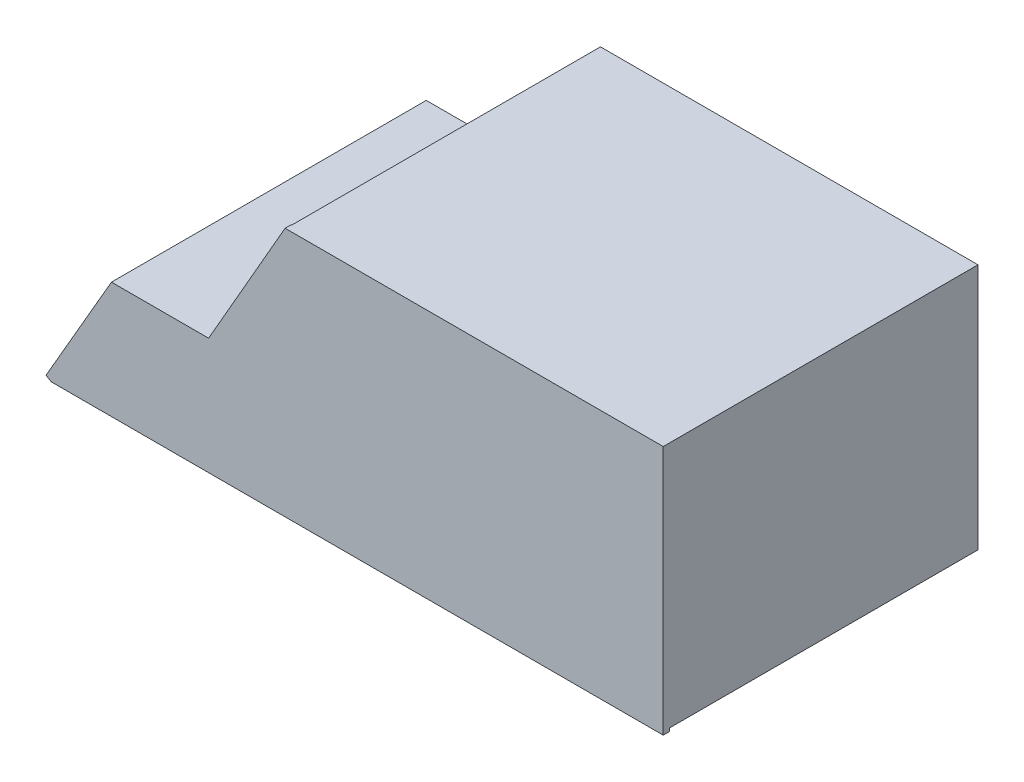
ISO-10303-21;
HEADER;
FILE_DESCRIPTION(('STEP AP214'),'2;1');
FILE_NAME('part.step','',(''),(''),'','','');
FILE_SCHEMA(('AUTOMOTIVE_DESIGN { 1 0 10303 214 1 1 1 1 }'));
ENDSEC;
DATA;
#1=APPLICATION_CONTEXT('core data for automotive mechanical design processes');
#2=APPLICATION_PROTOCOL_DEFINITION('international standard','automotive_design',2000,#1);
#3=PRODUCT_CONTEXT('',#1,'mechanical');
#4=PRODUCT('Part','Part','',(#3));
#5=PRODUCT_RELATED_PRODUCT_CATEGORY('part','',(#4));
#6=PRODUCT_DEFINITION_FORMATION('','',#4);
#7=PRODUCT_DEFINITION_CONTEXT('part definition',#1,'design');
#8=PRODUCT_DEFINITION('design','',#6,#7);
#9=PRODUCT_DEFINITION_SHAPE('','',#8);
#10=(LENGTH_UNIT() NAMED_UNIT(*) SI_UNIT(.MILLI.,.METRE.));
#11=(NAMED_UNIT(*) PLANE_ANGLE_UNIT() SI_UNIT($,.RADIAN.));
#12=(NAMED_UNIT(*) SI_UNIT($,.STERADIAN.) SOLID_ANGLE_UNIT());
#13=UNCERTAINTY_MEASURE_WITH_UNIT(LENGTH_MEASURE(1.E-05),#10,'distance_accuracy_value','');
#14=(GEOMETRIC_REPRESENTATION_CONTEXT(3) GLOBAL_UNCERTAINTY_ASSIGNED_CONTEXT((#13)) GLOBAL_UNIT_ASSIGNED_CONTEXT((#10,
#11,#12)) REPRESENTATION_CONTEXT('',''));
#15=CARTESIAN_POINT('',(0.,0.,0.));
#16=DIRECTION('',(0.,0.,1.));
#17=DIRECTION('',(1.,0.,0.));
#18=AXIS2_PLACEMENT_3D('',#15,#16,#17);
#19=CARTESIAN_POINT('',(148.41450507733,79.6367132867134,100.));
#20=DIRECTION('',(1.,0.,0.));
#21=DIRECTION('',(0.,0.,-1.));
#22=AXIS2_PLACEMENT_3D('',#19,#20,#21);
#23=PLANE('',#22);
#24=DIRECTION('',(0.,1.,0.));
#25=VECTOR('',#24,1.);
#26=CARTESIAN_POINT('',(148.41450507733,79.6367132867134,0.));
#27=LINE('',#26,#25);
#28=CARTESIAN_POINT('',(148.41450507733,77.6367132867134,0.));
#29=VERTEX_POINT('',#28);
#30=CARTESIAN_POINT('',(148.41450507733,-0.363286713286629,0.));
#31=VERTEX_POINT('',#30);
#32=EDGE_CURVE('E159',#29,#31,#27,.F.);
#33=ORIENTED_EDGE('',*,*,#32,.T.);
#34=DIRECTION('',(0.,0.,-1.));
#35=VECTOR('',#34,1.);
#36=CARTESIAN_POINT('',(148.41450507733,-0.363286713286629,100.));
#37=LINE('',#36,#35);
#38=CARTESIAN_POINT('',(148.41450507733,-0.363286713286629,100.));
#39=VERTEX_POINT('',#38);
#40=EDGE_CURVE('E11',#39,#31,#37,.T.);
#41=ORIENTED_EDGE('',*,*,#40,.F.);
#42=DIRECTION('',(0.,1.,0.));
#43=VECTOR('',#42,1.);
#44=CARTESIAN_POINT('',(148.41450507733,79.6367132867134,100.));
#45=LINE('',#44,#43);
#46=CARTESIAN_POINT('',(148.41450507733,77.6367132867134,100.));
#47=VERTEX_POINT('',#46);
#48=EDGE_CURVE('E188',#47,#39,#45,.F.);
#49=ORIENTED_EDGE('',*,*,#48,.F.);
#50=DIRECTION('',(0.,0.,-1.));
#51=VECTOR('',#50,1.);
#52=CARTESIAN_POINT('',(148.41450507733,77.6367132867134,100.));
#53=LINE('',#52,#51);
#54=EDGE_CURVE('E158',#47,#29,#53,.T.);
#55=ORIENTED_EDGE('',*,*,#54,.T.);
#56=EDGE_LOOP('',(#33,#41,#49,#55));
#57=FACE_BOUND('',#56,.T.);
#58=ADVANCED_FACE('F31',(#57),#23,.F.);
#59=CARTESIAN_POINT('',(150.41450507733,-0.363286713286632,100.));
#60=DIRECTION('',(0.,-1.,0.));
#61=DIRECTION('',(1.,0.,0.));
#62=AXIS2_PLACEMENT_3D('',#59,#60,#61);
#63=PLANE('',#62);
#64=DIRECTION('',(-1.,0.,0.));
#65=VECTOR('',#64,1.);
#66=CARTESIAN_POINT('',(150.41450507733,-0.363286713286632,0.));
#67=LINE('',#66,#65);
#68=CARTESIAN_POINT('',(150.41450507733,-0.363286713286632,0.));
#69=VERTEX_POINT('',#68);
#70=EDGE_CURVE('E161',#69,#31,#67,.T.);
#71=ORIENTED_EDGE('',*,*,#70,.F.);
#72=DIRECTION('',(0.,0.,-1.));
#73=VECTOR('',#72,1.);
#74=CARTESIAN_POINT('',(150.41450507733,-0.363286713286632,100.));
#75=LINE('',#74,#73);
#76=CARTESIAN_POINT('',(150.41450507733,-0.363286713286632,100.));
#77=VERTEX_POINT('',#76);
#78=EDGE_CURVE('E41',#77,#69,#75,.T.);
#79=ORIENTED_EDGE('',*,*,#78,.F.);
#80=DIRECTION('',(-1.,0.,0.));
#81=VECTOR('',#80,1.);
#82=CARTESIAN_POINT('',(150.41450507733,-0.363286713286632,100.));
#83=LINE('',#82,#81);
#84=EDGE_CURVE('E34',#77,#39,#83,.T.);
#85=ORIENTED_EDGE('',*,*,#84,.T.);
#86=ORIENTED_EDGE('',*,*,#40,.T.);
#87=EDGE_LOOP('',(#71,#79,#85,#86));
#88=FACE_BOUND('',#87,.T.);
#89=ADVANCED_FACE('F217',(#88),#63,.T.);
#90=CARTESIAN_POINT('',(150.41450507733,79.6367132867134,100.));
#91=DIRECTION('',(1.,0.,0.));
#92=DIRECTION('',(0.,0.,-1.));
#93=AXIS2_PLACEMENT_3D('',#90,#91,#92);
#94=PLANE('',#93);
#95=DIRECTION('',(0.,-1.,0.));
#96=VECTOR('',#95,1.);
#97=CARTESIAN_POINT('',(150.41450507733,79.6367132867134,0.));
#98=LINE('',#97,#96);
#99=CARTESIAN_POINT('',(150.41450507733,79.6367132867134,0.));
#100=VERTEX_POINT('',#99);
#101=EDGE_CURVE('E165',#100,#69,#98,.T.);
#102=ORIENTED_EDGE('',*,*,#101,.F.);
#103=DIRECTION('',(0.,0.,-1.));
#104=VECTOR('',#103,1.);
#105=CARTESIAN_POINT('',(150.41450507733,79.6367132867134,100.));
#106=LINE('',#105,#104);
#107=CARTESIAN_POINT('',(150.41450507733,79.6367132867134,102.));
#108=VERTEX_POINT('',#107);
#109=EDGE_CURVE('E200',#108,#100,#106,.T.);
#110=ORIENTED_EDGE('',*,*,#109,.F.);
#111=DIRECTION('',(0.,1.,0.));
#112=VECTOR('',#111,1.);
#113=CARTESIAN_POINT('',(150.41450507733,79.6367132867134,102.));
#114=LINE('',#113,#112);
#115=CARTESIAN_POINT('',(150.41450507733,-1.3632867132866,102.));
#116=VERTEX_POINT('',#115);
#117=EDGE_CURVE('E234',#116,#108,#114,.T.);
#118=ORIENTED_EDGE('',*,*,#117,.F.);
#119=DIRECTION('',(0.,0.,-1.));
#120=VECTOR('',#119,1.);
#121=CARTESIAN_POINT('',(150.41450507733,-1.3632867132866,102.));
#122=LINE('',#121,#120);
#123=CARTESIAN_POINT('',(150.41450507733,-1.3632867132866,100.));
#124=VERTEX_POINT('',#123);
#125=EDGE_CURVE('E279',#116,#124,#122,.T.);
#126=ORIENTED_EDGE('',*,*,#125,.T.);
#127=DIRECTION('',(0.,1.,0.));
#128=VECTOR('',#127,1.);
#129=CARTESIAN_POINT('',(150.41450507733,79.6367132867134,100.));
#130=LINE('',#129,#128);
#131=EDGE_CURVE('E215',#124,#77,#130,.T.);
#132=ORIENTED_EDGE('',*,*,#131,.T.);
#133=ORIENTED_EDGE('',*,*,#78,.T.);
#134=EDGE_LOOP('',(#102,#110,#118,#126,#132,#133));
#135=FACE_BOUND('',#134,.T.);
#136=ADVANCED_FACE('F212',(#135),#94,.T.);
#137=CARTESIAN_POINT('',(28.0835250406207,79.6367132867134,100.));
#138=DIRECTION('',(0.,1.,0.));
#139=DIRECTION('',(0.,0.,1.));
#140=AXIS2_PLACEMENT_3D('',#137,#138,#139);
#141=PLANE('',#140);
#142=DIRECTION('',(1.,0.,0.));
#143=VECTOR('',#142,1.);
#144=CARTESIAN_POINT('',(28.0835250406207,79.6367132867134,0.));
#145=LINE('',#144,#143);
#146=CARTESIAN_POINT('',(28.0835250406207,79.6367132867134,0.));
#147=VERTEX_POINT('',#146);
#148=EDGE_CURVE('E168',#147,#100,#145,.T.);
#149=ORIENTED_EDGE('',*,*,#148,.F.);
#150=DIRECTION('',(0.,0.,-1.));
#151=VECTOR('',#150,1.);
#152=CARTESIAN_POINT('',(28.0835250406207,79.6367132867134,100.));
#153=LINE('',#152,#151);
#154=CARTESIAN_POINT('',(28.0835250406207,79.6367132867134,100.));
#155=VERTEX_POINT('',#154);
#156=EDGE_CURVE('E199',#155,#147,#153,.T.);
#157=ORIENTED_EDGE('',*,*,#156,.F.);
#158=DIRECTION('',(-1.,0.,0.));
#159=VECTOR('',#158,1.);
#160=CARTESIAN_POINT('',(150.41450507733,79.6367132867134,100.));
#161=LINE('',#160,#159);
#162=CARTESIAN_POINT('',(27.8991416528759,79.6367132867134,100.));
#163=VERTEX_POINT('',#162);
#164=EDGE_CURVE('E256',#155,#163,#161,.T.);
#165=ORIENTED_EDGE('',*,*,#164,.T.);
#166=DIRECTION('',(0.,0.,-1.));
#167=VECTOR('',#166,1.);
#168=CARTESIAN_POINT('',(27.8991416528759,79.6367132867134,102.));
#169=LINE('',#168,#167);
#170=CARTESIAN_POINT('',(27.8991416528759,79.6367132867134,102.));
#171=VERTEX_POINT('',#170);
#172=EDGE_CURVE('E162',#171,#163,#169,.T.);
#173=ORIENTED_EDGE('',*,*,#172,.F.);
#174=DIRECTION('',(-1.,0.,0.));
#175=VECTOR('',#174,1.);
#176=CARTESIAN_POINT('',(150.41450507733,79.6367132867134,102.));
#177=LINE('',#176,#175);
#178=EDGE_CURVE('E230',#108,#171,#177,.T.);
#179=ORIENTED_EDGE('',*,*,#178,.F.);
#180=ORIENTED_EDGE('',*,*,#109,.T.);
#181=EDGE_LOOP('',(#149,#157,#165,#173,#179,#180));
#182=FACE_BOUND('',#181,.T.);
#183=ADVANCED_FACE('F224',(#182),#141,.T.);
#184=CARTESIAN_POINT('',(3.10870694104737,36.3790594284613,100.));
#185=DIRECTION('',(-0.86602540378444,0.499999999999998,0.));
#186=DIRECTION('',(-0.499999999999998,-0.86602540378444,0.));
#187=AXIS2_PLACEMENT_3D('',#184,#185,#186);
#188=PLANE('',#187);
#189=DIRECTION('',(0.499999999999998,0.86602540378444,0.));
#190=VECTOR('',#189,1.);
#191=CARTESIAN_POINT('',(3.10870694104737,36.3790594284613,0.));
#192=LINE('',#191,#190);
#193=CARTESIAN_POINT('',(3.10870694104737,36.3790594284613,0.));
#194=VERTEX_POINT('',#193);
#195=EDGE_CURVE('E171',#194,#147,#192,.T.);
#196=ORIENTED_EDGE('',*,*,#195,.F.);
#197=DIRECTION('',(0.,0.,-1.));
#198=VECTOR('',#197,1.);
#199=CARTESIAN_POINT('',(3.10870694104737,36.3790594284613,100.));
#200=LINE('',#199,#198);
#201=CARTESIAN_POINT('',(3.10870694104737,36.3790594284613,100.));
#202=VERTEX_POINT('',#201);
#203=EDGE_CURVE('E197',#202,#194,#200,.T.);
#204=ORIENTED_EDGE('',*,*,#203,.F.);
#205=DIRECTION('',(0.499999999999998,0.86602540378444,0.));
#206=VECTOR('',#205,1.);
#207=CARTESIAN_POINT('',(3.10870694104737,36.3790594284613,100.));
#208=LINE('',#207,#206);
#209=EDGE_CURVE('E147',#202,#155,#208,.T.);
#210=ORIENTED_EDGE('',*,*,#209,.T.);
#211=ORIENTED_EDGE('',*,*,#156,.T.);
#212=EDGE_LOOP('',(#196,#204,#210,#211));
#213=FACE_BOUND('',#212,.T.);
#214=ADVANCED_FACE('F321',(#213),#188,.T.);
#215=CARTESIAN_POINT('',(-28.3722914870734,36.3790594284613,100.));
#216=DIRECTION('',(0.,1.,0.));
#217=DIRECTION('',(0.,0.,1.));
#218=AXIS2_PLACEMENT_3D('',#215,#216,#217);
#219=PLANE('',#218);
#220=DIRECTION('',(1.,0.,0.));
#221=VECTOR('',#220,1.);
#222=CARTESIAN_POINT('',(-28.3722914870734,36.3790594284613,0.));
#223=LINE('',#222,#221);
#224=CARTESIAN_POINT('',(-28.3722914870734,36.3790594284613,0.));
#225=VERTEX_POINT('',#224);
#226=EDGE_CURVE('E174',#225,#194,#223,.T.);
#227=ORIENTED_EDGE('',*,*,#226,.F.);
#228=DIRECTION('',(0.,0.,-1.));
#229=VECTOR('',#228,1.);
#230=CARTESIAN_POINT('',(-28.3722914870734,36.3790594284613,100.));
#231=LINE('',#230,#229);
#232=CARTESIAN_POINT('',(-28.3722914870734,36.3790594284613,102.));
#233=VERTEX_POINT('',#232);
#234=EDGE_CURVE('E195',#233,#225,#231,.T.);
#235=ORIENTED_EDGE('',*,*,#234,.F.);
#236=DIRECTION('',(-1.,0.,0.));
#237=VECTOR('',#236,1.);
#238=CARTESIAN_POINT('',(-28.3722914870734,36.3790594284613,102.));
#239=LINE('',#238,#237);
#240=CARTESIAN_POINT('',(3.10870694104737,36.3790594284613,102.));
#241=VERTEX_POINT('',#240);
#242=EDGE_CURVE('E293',#241,#233,#239,.T.);
#243=ORIENTED_EDGE('',*,*,#242,.F.);
#244=DIRECTION('',(0.,0.,-1.));
#245=VECTOR('',#244,1.);
#246=CARTESIAN_POINT('',(3.10870694104737,36.3790594284613,102.));
#247=LINE('',#246,#245);
#248=EDGE_CURVE('E270',#241,#202,#247,.T.);
#249=ORIENTED_EDGE('',*,*,#248,.T.);
#250=ORIENTED_EDGE('',*,*,#203,.T.);
#251=EDGE_LOOP('',(#227,#235,#243,#249,#250));
#252=FACE_BOUND('',#251,.T.);
#253=ADVANCED_FACE('F318',(#252),#219,.T.);
#254=CARTESIAN_POINT('',(-49.5854949226698,-0.363286713286632,100.));
#255=DIRECTION('',(-0.86602540378444,0.499999999999998,0.));
#256=DIRECTION('',(-0.499999999999998,-0.86602540378444,0.));
#257=AXIS2_PLACEMENT_3D('',#254,#255,#256);
#258=PLANE('',#257);
#259=DIRECTION('',(0.499999999999998,0.86602540378444,0.));
#260=VECTOR('',#259,1.);
#261=CARTESIAN_POINT('',(-49.5854949226698,-0.363286713286632,0.));
#262=LINE('',#261,#260);
#263=CARTESIAN_POINT('',(-49.5854949226698,-0.363286713286632,0.));
#264=VERTEX_POINT('',#263);
#265=EDGE_CURVE('E177',#264,#225,#262,.T.);
#266=ORIENTED_EDGE('',*,*,#265,.F.);
#267=DIRECTION('',(0.,0.,-1.));
#268=VECTOR('',#267,1.);
#269=CARTESIAN_POINT('',(-49.5854949226698,-0.363286713286632,100.));
#270=LINE('',#269,#268);
#271=CARTESIAN_POINT('',(-49.5854949226698,-0.363286713286632,102.));
#272=VERTEX_POINT('',#271);
#273=EDGE_CURVE('E193',#272,#264,#270,.T.);
#274=ORIENTED_EDGE('',*,*,#273,.F.);
#275=DIRECTION('',(-0.499999999999998,-0.86602540378444,0.));
#276=VECTOR('',#275,1.);
#277=CARTESIAN_POINT('',(-49.5854949226698,-0.363286713286632,102.));
#278=LINE('',#277,#276);
#279=EDGE_CURVE('E290',#233,#272,#278,.T.);
#280=ORIENTED_EDGE('',*,*,#279,.F.);
#281=ORIENTED_EDGE('',*,*,#234,.T.);
#282=EDGE_LOOP('',(#266,#274,#280,#281));
#283=FACE_BOUND('',#282,.T.);
#284=ADVANCED_FACE('F315',(#283),#258,.T.);
#285=CARTESIAN_POINT('',(-47.8534441151009,-1.36328671328663,100.));
#286=DIRECTION('',(-0.499999999999998,-0.86602540378444,0.));
#287=DIRECTION('',(0.86602540378444,-0.499999999999998,0.));
#288=AXIS2_PLACEMENT_3D('',#285,#286,#287);
#289=PLANE('',#288);
#290=DIRECTION('',(-0.86602540378444,0.499999999999998,0.));
#291=VECTOR('',#290,1.);
#292=CARTESIAN_POINT('',(-47.8534441151009,-1.36328671328663,0.));
#293=LINE('',#292,#291);
#294=CARTESIAN_POINT('',(-47.8534441151009,-1.36328671328663,0.));
#295=VERTEX_POINT('',#294);
#296=EDGE_CURVE('E180',#295,#264,#293,.T.);
#297=ORIENTED_EDGE('',*,*,#296,.F.);
#298=DIRECTION('',(0.,0.,-1.));
#299=VECTOR('',#298,1.);
#300=CARTESIAN_POINT('',(-47.8534441151009,-1.36328671328663,100.));
#301=LINE('',#300,#299);
#302=CARTESIAN_POINT('',(-47.8534441151009,-1.36328671328663,100.));
#303=VERTEX_POINT('',#302);
#304=EDGE_CURVE('E131',#303,#295,#301,.T.);
#305=ORIENTED_EDGE('',*,*,#304,.F.);
#306=DIRECTION('',(0.,0.,-1.));
#307=VECTOR('',#306,1.);
#308=CARTESIAN_POINT('',(-47.8534441151009,-1.36328671328663,102.));
#309=LINE('',#308,#307);
#310=CARTESIAN_POINT('',(-47.8534441151009,-1.36328671328663,102.));
#311=VERTEX_POINT('',#310);
#312=EDGE_CURVE('E281',#311,#303,#309,.T.);
#313=ORIENTED_EDGE('',*,*,#312,.F.);
#314=DIRECTION('',(0.86602540378444,-0.499999999999998,0.));
#315=VECTOR('',#314,1.);
#316=CARTESIAN_POINT('',(-47.8534441151009,-1.36328671328663,102.));
#317=LINE('',#316,#315);
#318=EDGE_CURVE('E288',#272,#311,#317,.T.);
#319=ORIENTED_EDGE('',*,*,#318,.F.);
#320=ORIENTED_EDGE('',*,*,#273,.T.);
#321=EDGE_LOOP('',(#297,#305,#313,#319,#320));
#322=FACE_BOUND('',#321,.T.);
#323=ADVANCED_FACE('F311',(#322),#289,.T.);
#324=CARTESIAN_POINT('',(-47.8534441151009,-1.36328671328663,100.));
#325=DIRECTION('',(-0.86602540378444,0.499999999999998,0.));
#326=DIRECTION('',(-0.499999999999998,-0.86602540378444,0.));
#327=AXIS2_PLACEMENT_3D('',#324,#325,#326);
#328=PLANE('',#327);
#329=DIRECTION('',(0.499999999999998,0.86602540378444,0.));
#330=VECTOR('',#329,1.);
#331=CARTESIAN_POINT('',(-47.8534441151009,-1.36328671328663,0.));
#332=LINE('',#331,#330);
#333=CARTESIAN_POINT('',(-27.2175909486941,34.3790594284613,0.));
#334=VERTEX_POINT('',#333);
#335=EDGE_CURVE('E128',#295,#334,#332,.T.);
#336=ORIENTED_EDGE('',*,*,#335,.T.);
#337=DIRECTION('',(0.,0.,-1.));
#338=VECTOR('',#337,1.);
#339=CARTESIAN_POINT('',(-27.2175909486941,34.3790594284613,100.));
#340=LINE('',#339,#338);
#341=CARTESIAN_POINT('',(-27.2175909486941,34.3790594284613,100.));
#342=VERTEX_POINT('',#341);
#343=EDGE_CURVE('E121',#342,#334,#340,.T.);
#344=ORIENTED_EDGE('',*,*,#343,.F.);
#345=DIRECTION('',(0.499999999999998,0.86602540378444,0.));
#346=VECTOR('',#345,1.);
#347=CARTESIAN_POINT('',(-47.8534441151009,-1.36328671328663,100.));
#348=LINE('',#347,#346);
#349=EDGE_CURVE('E125',#303,#342,#348,.T.);
#350=ORIENTED_EDGE('',*,*,#349,.F.);
#351=ORIENTED_EDGE('',*,*,#304,.T.);
#352=EDGE_LOOP('',(#336,#344,#350,#351));
#353=FACE_BOUND('',#352,.T.);
#354=ADVANCED_FACE('F123',(#353),#328,.F.);
#355=CARTESIAN_POINT('',(-28.3722914870734,34.3790594284613,100.));
#356=DIRECTION('',(0.,1.,0.));
#357=DIRECTION('',(0.,0.,1.));
#358=AXIS2_PLACEMENT_3D('',#355,#356,#357);
#359=PLANE('',#358);
#360=DIRECTION('',(1.,0.,0.));
#361=VECTOR('',#360,1.);
#362=CARTESIAN_POINT('',(-28.3722914870734,34.3790594284613,0.));
#363=LINE('',#362,#361);
#364=CARTESIAN_POINT('',(4.26340747942662,34.3790594284613,0.));
#365=VERTEX_POINT('',#364);
#366=EDGE_CURVE('E184',#334,#365,#363,.T.);
#367=ORIENTED_EDGE('',*,*,#366,.T.);
#368=DIRECTION('',(0.,0.,-1.));
#369=VECTOR('',#368,1.);
#370=CARTESIAN_POINT('',(4.26340747942662,34.3790594284613,100.));
#371=LINE('',#370,#369);
#372=CARTESIAN_POINT('',(4.26340747942662,34.3790594284613,100.));
#373=VERTEX_POINT('',#372);
#374=EDGE_CURVE('E132',#373,#365,#371,.T.);
#375=ORIENTED_EDGE('',*,*,#374,.F.);
#376=DIRECTION('',(1.,0.,0.));
#377=VECTOR('',#376,1.);
#378=CARTESIAN_POINT('',(-28.3722914870734,34.3790594284613,100.));
#379=LINE('',#378,#377);
#380=EDGE_CURVE('E135',#342,#373,#379,.T.);
#381=ORIENTED_EDGE('',*,*,#380,.F.);
#382=ORIENTED_EDGE('',*,*,#343,.T.);
#383=EDGE_LOOP('',(#367,#375,#381,#382));
#384=FACE_BOUND('',#383,.T.);
#385=ADVANCED_FACE('F136',(#384),#359,.F.);
#386=CARTESIAN_POINT('',(4.84075774861625,35.3790594284613,100.));
#387=DIRECTION('',(-0.86602540378444,0.499999999999998,0.));
#388=DIRECTION('',(-0.499999999999998,-0.86602540378444,0.));
#389=AXIS2_PLACEMENT_3D('',#386,#387,#388);
#390=PLANE('',#389);
#391=DIRECTION('',(0.499999999999998,0.86602540378444,0.));
#392=VECTOR('',#391,1.);
#393=CARTESIAN_POINT('',(4.84075774861625,35.3790594284613,0.));
#394=LINE('',#393,#392);
#395=CARTESIAN_POINT('',(29.2382255789999,77.6367132867134,0.));
#396=VERTEX_POINT('',#395);
#397=EDGE_CURVE('E89',#365,#396,#394,.T.);
#398=ORIENTED_EDGE('',*,*,#397,.T.);
#399=DIRECTION('',(0.,0.,-1.));
#400=VECTOR('',#399,1.);
#401=CARTESIAN_POINT('',(29.2382255789999,77.6367132867134,100.));
#402=LINE('',#401,#400);
#403=CARTESIAN_POINT('',(29.2382255789999,77.6367132867134,100.));
#404=VERTEX_POINT('',#403);
#405=EDGE_CURVE('E50',#404,#396,#402,.T.);
#406=ORIENTED_EDGE('',*,*,#405,.F.);
#407=DIRECTION('',(0.499999999999998,0.86602540378444,0.));
#408=VECTOR('',#407,1.);
#409=CARTESIAN_POINT('',(4.84075774861625,35.3790594284613,100.));
#410=LINE('',#409,#408);
#411=EDGE_CURVE('E139',#373,#404,#410,.T.);
#412=ORIENTED_EDGE('',*,*,#411,.F.);
#413=ORIENTED_EDGE('',*,*,#374,.T.);
#414=EDGE_LOOP('',(#398,#406,#412,#413));
#415=FACE_BOUND('',#414,.T.);
#416=ADVANCED_FACE('F308',(#415),#390,.F.);
#417=CARTESIAN_POINT('',(28.0835250406207,77.6367132867134,100.));
#418=DIRECTION('',(0.,1.,0.));
#419=DIRECTION('',(0.,0.,1.));
#420=AXIS2_PLACEMENT_3D('',#417,#418,#419);
#421=PLANE('',#420);
#422=DIRECTION('',(1.,0.,0.));
#423=VECTOR('',#422,1.);
#424=CARTESIAN_POINT('',(28.0835250406207,77.6367132867134,0.));
#425=LINE('',#424,#423);
#426=EDGE_CURVE('E95',#396,#29,#425,.T.);
#427=ORIENTED_EDGE('',*,*,#426,.T.);
#428=ORIENTED_EDGE('',*,*,#54,.F.);
#429=DIRECTION('',(1.,0.,0.));
#430=VECTOR('',#429,1.);
#431=CARTESIAN_POINT('',(28.0835250406207,77.6367132867134,100.));
#432=LINE('',#431,#430);
#433=EDGE_CURVE('E155',#404,#47,#432,.T.);
#434=ORIENTED_EDGE('',*,*,#433,.F.);
#435=ORIENTED_EDGE('',*,*,#405,.T.);
#436=EDGE_LOOP('',(#427,#428,#434,#435));
#437=FACE_BOUND('',#436,.T.);
#438=ADVANCED_FACE('F307',(#437),#421,.F.);
#439=CARTESIAN_POINT('',(148.41450507733,79.6367132867134,0.));
#440=DIRECTION('',(0.,0.,-1.));
#441=DIRECTION('',(-1.,0.,0.));
#442=AXIS2_PLACEMENT_3D('',#439,#440,#441);
#443=PLANE('',#442);
#444=ORIENTED_EDGE('',*,*,#32,.F.);
#445=ORIENTED_EDGE('',*,*,#426,.F.);
#446=ORIENTED_EDGE('',*,*,#397,.F.);
#447=ORIENTED_EDGE('',*,*,#366,.F.);
#448=ORIENTED_EDGE('',*,*,#335,.F.);
#449=ORIENTED_EDGE('',*,*,#296,.T.);
#450=ORIENTED_EDGE('',*,*,#265,.T.);
#451=ORIENTED_EDGE('',*,*,#226,.T.);
#452=ORIENTED_EDGE('',*,*,#195,.T.);
#453=ORIENTED_EDGE('',*,*,#148,.T.);
#454=ORIENTED_EDGE('',*,*,#101,.T.);
#455=ORIENTED_EDGE('',*,*,#70,.T.);
#456=EDGE_LOOP('',(#444,#445,#446,#447,#448,#449,#450,#451,#452,#453,#454,#455));
#457=FACE_BOUND('',#456,.T.);
#458=ADVANCED_FACE('F220',(#457),#443,.T.);
#459=CARTESIAN_POINT('',(150.41450507733,36.3790594284613,100.));
#460=DIRECTION('',(0.,0.,1.));
#461=DIRECTION('',(1.,0.,0.));
#462=AXIS2_PLACEMENT_3D('',#459,#460,#461);
#463=PLANE('',#462);
#464=ORIENTED_EDGE('',*,*,#209,.F.);
#465=DIRECTION('',(-0.497223791028421,-0.86762232661183,0.));
#466=VECTOR('',#465,1.);
#467=CARTESIAN_POINT('',(3.10870694104737,36.3790594284613,100.));
#468=LINE('',#467,#466);
#469=EDGE_CURVE('E262',#163,#202,#468,.T.);
#470=ORIENTED_EDGE('',*,*,#469,.F.);
#471=ORIENTED_EDGE('',*,*,#164,.F.);
#472=EDGE_LOOP('',(#464,#470,#471));
#473=FACE_BOUND('',#472,.T.);
#474=ADVANCED_FACE('F272',(#473),#463,.F.);
#475=CARTESIAN_POINT('',(3.10870694104737,36.3790594284613,102.));
#476=DIRECTION('',(0.86762232661183,-0.497223791028421,0.));
#477=DIRECTION('',(0.497223791028421,0.86762232661183,0.));
#478=AXIS2_PLACEMENT_3D('',#475,#476,#477);
#479=PLANE('',#478);
#480=ORIENTED_EDGE('',*,*,#469,.T.);
#481=ORIENTED_EDGE('',*,*,#248,.F.);
#482=DIRECTION('',(-0.497223791028421,-0.86762232661183,0.));
#483=VECTOR('',#482,1.);
#484=CARTESIAN_POINT('',(3.10870694104737,36.3790594284613,102.));
#485=LINE('',#484,#483);
#486=EDGE_CURVE('E269',#171,#241,#485,.T.);
#487=ORIENTED_EDGE('',*,*,#486,.F.);
#488=ORIENTED_EDGE('',*,*,#172,.T.);
#489=EDGE_LOOP('',(#480,#481,#487,#488));
#490=FACE_BOUND('',#489,.T.);
#491=ADVANCED_FACE('F266',(#490),#479,.F.);
#492=CARTESIAN_POINT('',(150.41450507733,-1.3632867132866,102.));
#493=DIRECTION('',(0.,1.,0.));
#494=DIRECTION('',(-1.,0.,0.));
#495=AXIS2_PLACEMENT_3D('',#492,#493,#494);
#496=PLANE('',#495);
#497=DIRECTION('',(1.,0.,0.));
#498=VECTOR('',#497,1.);
#499=CARTESIAN_POINT('',(150.41450507733,-1.3632867132866,100.));
#500=LINE('',#499,#498);
#501=EDGE_CURVE('E145',#303,#124,#500,.T.);
#502=ORIENTED_EDGE('',*,*,#501,.T.);
#503=ORIENTED_EDGE('',*,*,#125,.F.);
#504=DIRECTION('',(1.,0.,0.));
#505=VECTOR('',#504,1.);
#506=CARTESIAN_POINT('',(27.911407902159,-1.36328671328662,102.));
#507=LINE('',#506,#505);
#508=EDGE_CURVE('E282',#311,#116,#507,.T.);
#509=ORIENTED_EDGE('',*,*,#508,.F.);
#510=ORIENTED_EDGE('',*,*,#312,.T.);
#511=EDGE_LOOP('',(#502,#503,#509,#510));
#512=FACE_BOUND('',#511,.T.);
#513=ADVANCED_FACE('F305',(#512),#496,.F.);
#514=CARTESIAN_POINT('',(150.41450507733,36.3790594284613,102.));
#515=DIRECTION('',(0.,0.,1.));
#516=DIRECTION('',(1.,0.,0.));
#517=AXIS2_PLACEMENT_3D('',#514,#515,#516);
#518=PLANE('',#517);
#519=ORIENTED_EDGE('',*,*,#117,.T.);
#520=ORIENTED_EDGE('',*,*,#178,.T.);
#521=ORIENTED_EDGE('',*,*,#486,.T.);
#522=ORIENTED_EDGE('',*,*,#242,.T.);
#523=ORIENTED_EDGE('',*,*,#279,.T.);
#524=ORIENTED_EDGE('',*,*,#318,.T.);
#525=ORIENTED_EDGE('',*,*,#508,.T.);
#526=EDGE_LOOP('',(#519,#520,#521,#522,#523,#524,#525));
#527=FACE_BOUND('',#526,.T.);
#528=ADVANCED_FACE('F299',(#527),#518,.T.);
#529=ORIENTED_EDGE('',*,*,#84,.F.);
#530=ORIENTED_EDGE('',*,*,#131,.F.);
#531=ORIENTED_EDGE('',*,*,#501,.F.);
#532=ORIENTED_EDGE('',*,*,#349,.T.);
#533=ORIENTED_EDGE('',*,*,#380,.T.);
#534=ORIENTED_EDGE('',*,*,#411,.T.);
#535=ORIENTED_EDGE('',*,*,#433,.T.);
#536=ORIENTED_EDGE('',*,*,#48,.T.);
#537=EDGE_LOOP('',(#529,#530,#531,#532,#533,#534,#535,#536));
#538=FACE_BOUND('',#537,.T.);
#539=ADVANCED_FACE('F142',(#538),#463,.F.);
#540=CLOSED_SHELL('',(#58,#89,#136,#183,#214,#253,#284,#323,#354,#385,#416,#438,#458,#474,#491,
#513,#528,#539));
#541=MANIFOLD_SOLID_BREP('B2',#540);
#542=ADVANCED_BREP_SHAPE_REPRESENTATION('',(#18,#541),#14);
#543=SHAPE_DEFINITION_REPRESENTATION(#9,#542);
ENDSEC;
END-ISO-10303-21;
